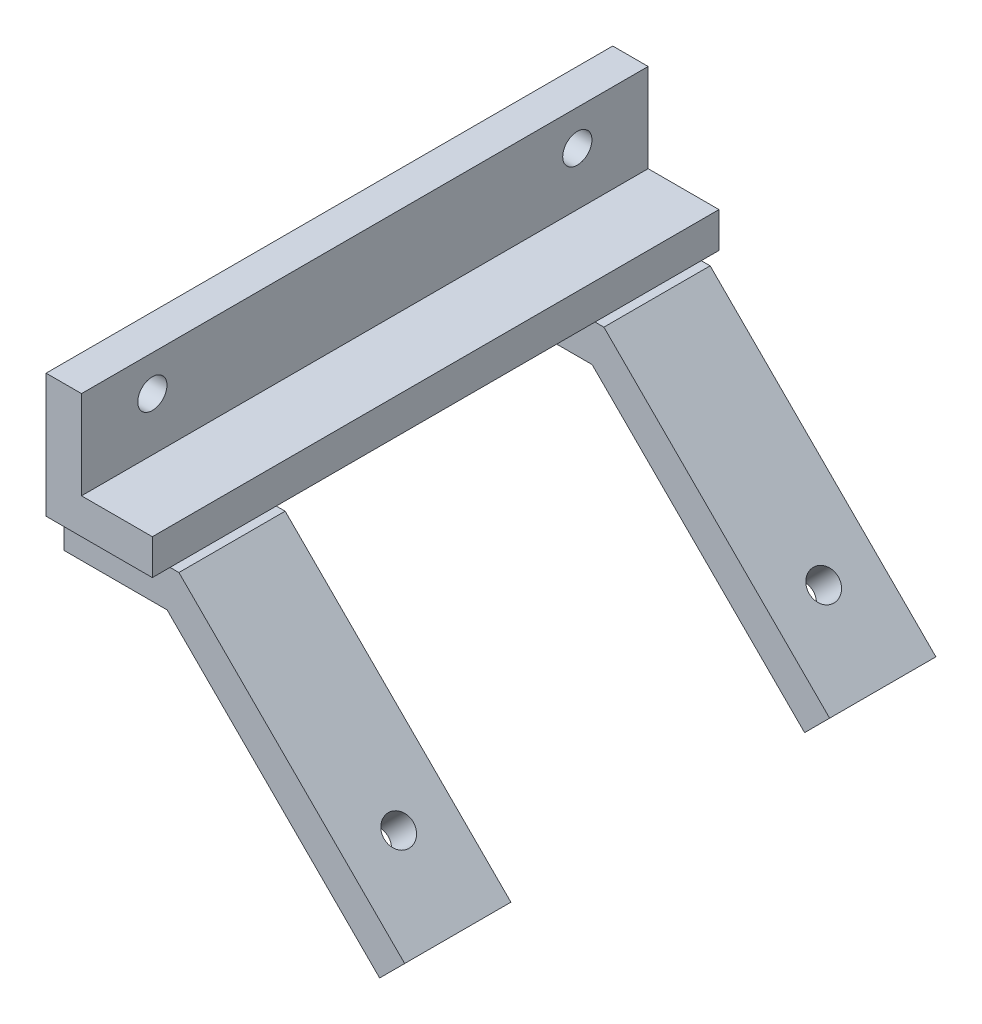
ISO-10303-21;
HEADER;
FILE_DESCRIPTION(('STEP AP214'),'2;1');
FILE_NAME('part.step','',(''),(''),'','','');
FILE_SCHEMA(('AUTOMOTIVE_DESIGN { 1 0 10303 214 1 1 1 1 }'));
ENDSEC;
DATA;
#1=APPLICATION_CONTEXT('core data for automotive mechanical design processes');
#2=APPLICATION_PROTOCOL_DEFINITION('international standard','automotive_design',2000,#1);
#3=PRODUCT_CONTEXT('',#1,'mechanical');
#4=PRODUCT('Part','Part','',(#3));
#5=PRODUCT_RELATED_PRODUCT_CATEGORY('part','',(#4));
#6=PRODUCT_DEFINITION_FORMATION('','',#4);
#7=PRODUCT_DEFINITION_CONTEXT('part definition',#1,'design');
#8=PRODUCT_DEFINITION('design','',#6,#7);
#9=PRODUCT_DEFINITION_SHAPE('','',#8);
#10=(LENGTH_UNIT() NAMED_UNIT(*) SI_UNIT(.MILLI.,.METRE.));
#11=(NAMED_UNIT(*) PLANE_ANGLE_UNIT() SI_UNIT($,.RADIAN.));
#12=(NAMED_UNIT(*) SI_UNIT($,.STERADIAN.) SOLID_ANGLE_UNIT());
#13=UNCERTAINTY_MEASURE_WITH_UNIT(LENGTH_MEASURE(1.E-05),#10,'distance_accuracy_value','');
#14=(GEOMETRIC_REPRESENTATION_CONTEXT(3) GLOBAL_UNCERTAINTY_ASSIGNED_CONTEXT((#13)) GLOBAL_UNIT_ASSIGNED_CONTEXT((#10,
#11,#12)) REPRESENTATION_CONTEXT('',''));
#15=CARTESIAN_POINT('',(0.,0.,0.));
#16=DIRECTION('',(0.,0.,1.));
#17=DIRECTION('',(1.,0.,0.));
#18=AXIS2_PLACEMENT_3D('',#15,#16,#17);
#19=CARTESIAN_POINT('',(0.,0.,32.));
#20=DIRECTION('',(0.,1.,0.));
#21=DIRECTION('',(0.,0.,1.));
#22=AXIS2_PLACEMENT_3D('',#19,#20,#21);
#23=PLANE('',#22);
#24=DIRECTION('',(-1.,0.,0.));
#25=VECTOR('',#24,1.);
#26=CARTESIAN_POINT('',(4.,0.,30.));
#27=LINE('',#26,#25);
#28=CARTESIAN_POINT('',(12.,0.,30.));
#29=VERTEX_POINT('',#28);
#30=CARTESIAN_POINT('',(0.,0.,30.));
#31=VERTEX_POINT('',#30);
#32=EDGE_CURVE('E194',#29,#31,#27,.T.);
#33=ORIENTED_EDGE('',*,*,#32,.F.);
#34=DIRECTION('',(0.,0.,-1.));
#35=VECTOR('',#34,1.);
#36=CARTESIAN_POINT('',(12.,0.,32.));
#37=LINE('',#36,#35);
#38=CARTESIAN_POINT('',(12.,0.,32.));
#39=VERTEX_POINT('',#38);
#40=EDGE_CURVE('E344',#39,#29,#37,.T.);
#41=ORIENTED_EDGE('',*,*,#40,.F.);
#42=DIRECTION('',(1.,0.,0.));
#43=VECTOR('',#42,1.);
#44=CARTESIAN_POINT('',(0.,0.,32.));
#45=LINE('',#44,#43);
#46=CARTESIAN_POINT('',(0.,0.,32.));
#47=VERTEX_POINT('',#46);
#48=EDGE_CURVE('E294',#47,#39,#45,.T.);
#49=ORIENTED_EDGE('',*,*,#48,.F.);
#50=DIRECTION('',(0.,0.,-1.));
#51=VECTOR('',#50,1.);
#52=CARTESIAN_POINT('',(0.,0.,32.));
#53=LINE('',#52,#51);
#54=EDGE_CURVE('E11',#47,#31,#53,.T.);
#55=ORIENTED_EDGE('',*,*,#54,.T.);
#56=EDGE_LOOP('',(#33,#41,#49,#55));
#57=FACE_BOUND('',#56,.T.);
#58=ADVANCED_FACE('F44',(#57),#23,.F.);
#59=CARTESIAN_POINT('',(12.,0.,18.));
#60=VERTEX_POINT('',#59);
#61=CARTESIAN_POINT('',(12.,0.,-18.));
#62=VERTEX_POINT('',#61);
#63=EDGE_CURVE('E348',#60,#62,#37,.T.);
#64=ORIENTED_EDGE('',*,*,#63,.F.);
#65=DIRECTION('',(-1.,0.,0.));
#66=VECTOR('',#65,1.);
#67=CARTESIAN_POINT('',(4.,0.,18.));
#68=LINE('',#67,#66);
#69=CARTESIAN_POINT('',(0.,0.,18.));
#70=VERTEX_POINT('',#69);
#71=EDGE_CURVE('E400',#60,#70,#68,.T.);
#72=ORIENTED_EDGE('',*,*,#71,.T.);
#73=CARTESIAN_POINT('',(0.,0.,-18.));
#74=VERTEX_POINT('',#73);
#75=EDGE_CURVE('E54',#70,#74,#53,.T.);
#76=ORIENTED_EDGE('',*,*,#75,.T.);
#77=DIRECTION('',(-1.,0.,0.));
#78=VECTOR('',#77,1.);
#79=CARTESIAN_POINT('',(4.,0.,-18.));
#80=LINE('',#79,#78);
#81=EDGE_CURVE('E248',#62,#74,#80,.T.);
#82=ORIENTED_EDGE('',*,*,#81,.F.);
#83=EDGE_LOOP('',(#64,#72,#76,#82));
#84=FACE_BOUND('',#83,.T.);
#85=ADVANCED_FACE('F468',(#84),#23,.F.);
#86=CARTESIAN_POINT('',(0.,14.,32.));
#87=DIRECTION('',(1.,0.,0.));
#88=DIRECTION('',(0.,0.,-1.));
#89=AXIS2_PLACEMENT_3D('',#86,#87,#88);
#90=PLANE('',#89);
#91=CARTESIAN_POINT('',(0.,10.,24.));
#92=DIRECTION('',(1.,0.,0.));
#93=DIRECTION('',(0.,0.,-1.));
#94=AXIS2_PLACEMENT_3D('',#91,#92,#93);
#95=CIRCLE('',#94,1.65);
#96=CARTESIAN_POINT('',(0.,10.,22.35));
#97=VERTEX_POINT('',#96);
#98=EDGE_CURVE('E354',#97,#97,#95,.T.);
#99=ORIENTED_EDGE('',*,*,#98,.T.);
#100=EDGE_LOOP('',(#99));
#101=FACE_BOUND('',#100,.T.);
#102=CARTESIAN_POINT('',(0.,10.,-24.));
#103=DIRECTION('',(1.,0.,0.));
#104=DIRECTION('',(0.,0.,-1.));
#105=AXIS2_PLACEMENT_3D('',#102,#103,#104);
#106=CIRCLE('',#105,1.65);
#107=CARTESIAN_POINT('',(0.,10.,-25.65));
#108=VERTEX_POINT('',#107);
#109=EDGE_CURVE('E221',#108,#108,#106,.T.);
#110=ORIENTED_EDGE('',*,*,#109,.T.);
#111=EDGE_LOOP('',(#110));
#112=FACE_BOUND('',#111,.T.);
#113=ORIENTED_EDGE('',*,*,#75,.F.);
#114=DIRECTION('',(0.,-1.,0.));
#115=VECTOR('',#114,1.);
#116=CARTESIAN_POINT('',(0.,0.,18.));
#117=LINE('',#116,#115);
#118=CARTESIAN_POINT('',(0.,-4.3284271247,18.));
#119=VERTEX_POINT('',#118);
#120=EDGE_CURVE('E199',#70,#119,#117,.T.);
#121=ORIENTED_EDGE('',*,*,#120,.T.);
#122=DIRECTION('',(0.,0.,-1.));
#123=VECTOR('',#122,1.);
#124=CARTESIAN_POINT('',(0.,-4.3284271247,30.));
#125=LINE('',#124,#123);
#126=CARTESIAN_POINT('',(0.,-4.3284271247,30.));
#127=VERTEX_POINT('',#126);
#128=EDGE_CURVE('E204',#127,#119,#125,.T.);
#129=ORIENTED_EDGE('',*,*,#128,.F.);
#130=DIRECTION('',(0.,-1.,0.));
#131=VECTOR('',#130,1.);
#132=CARTESIAN_POINT('',(0.,-4.3284271247,30.));
#133=LINE('',#132,#131);
#134=EDGE_CURVE('E187',#31,#127,#133,.T.);
#135=ORIENTED_EDGE('',*,*,#134,.F.);
#136=ORIENTED_EDGE('',*,*,#54,.F.);
#137=DIRECTION('',(0.,-1.,0.));
#138=VECTOR('',#137,1.);
#139=CARTESIAN_POINT('',(0.,14.,32.));
#140=LINE('',#139,#138);
#141=CARTESIAN_POINT('',(0.,14.,32.));
#142=VERTEX_POINT('',#141);
#143=EDGE_CURVE('E290',#142,#47,#140,.T.);
#144=ORIENTED_EDGE('',*,*,#143,.F.);
#145=DIRECTION('',(0.,0.,-1.));
#146=VECTOR('',#145,1.);
#147=CARTESIAN_POINT('',(0.,14.,32.));
#148=LINE('',#147,#146);
#149=CARTESIAN_POINT('',(0.,14.,-32.));
#150=VERTEX_POINT('',#149);
#151=EDGE_CURVE('E310',#142,#150,#148,.T.);
#152=ORIENTED_EDGE('',*,*,#151,.T.);
#153=DIRECTION('',(0.,-1.,0.));
#154=VECTOR('',#153,1.);
#155=CARTESIAN_POINT('',(0.,14.,-32.));
#156=LINE('',#155,#154);
#157=CARTESIAN_POINT('',(0.,0.,-32.));
#158=VERTEX_POINT('',#157);
#159=EDGE_CURVE('E289',#150,#158,#156,.T.);
#160=ORIENTED_EDGE('',*,*,#159,.T.);
#161=CARTESIAN_POINT('',(0.,0.,-30.));
#162=VERTEX_POINT('',#161);
#163=EDGE_CURVE('E56',#162,#158,#53,.T.);
#164=ORIENTED_EDGE('',*,*,#163,.F.);
#165=DIRECTION('',(0.,-1.,0.));
#166=VECTOR('',#165,1.);
#167=CARTESIAN_POINT('',(0.,0.,-30.));
#168=LINE('',#167,#166);
#169=CARTESIAN_POINT('',(0.,-4.3284271247,-30.));
#170=VERTEX_POINT('',#169);
#171=EDGE_CURVE('E236',#162,#170,#168,.T.);
#172=ORIENTED_EDGE('',*,*,#171,.T.);
#173=DIRECTION('',(0.,0.,-1.));
#174=VECTOR('',#173,1.);
#175=CARTESIAN_POINT('',(0.,-4.3284271247,-18.));
#176=LINE('',#175,#174);
#177=CARTESIAN_POINT('',(0.,-4.3284271247,-18.));
#178=VERTEX_POINT('',#177);
#179=EDGE_CURVE('E285',#178,#170,#176,.T.);
#180=ORIENTED_EDGE('',*,*,#179,.F.);
#181=DIRECTION('',(0.,-1.,0.));
#182=VECTOR('',#181,1.);
#183=CARTESIAN_POINT('',(0.,-4.3284271247,-18.));
#184=LINE('',#183,#182);
#185=EDGE_CURVE('E232',#74,#178,#184,.T.);
#186=ORIENTED_EDGE('',*,*,#185,.F.);
#187=EDGE_LOOP('',(#113,#121,#129,#135,#136,#144,#152,#160,#164,#172,#180,#186));
#188=FACE_BOUND('',#187,.T.);
#189=ADVANCED_FACE('F46',(#101,#112,#188),#90,.F.);
#190=CARTESIAN_POINT('',(12.,0.,-30.));
#191=VERTEX_POINT('',#190);
#192=CARTESIAN_POINT('',(12.,0.,-32.));
#193=VERTEX_POINT('',#192);
#194=EDGE_CURVE('E343',#191,#193,#37,.T.);
#195=ORIENTED_EDGE('',*,*,#194,.F.);
#196=DIRECTION('',(-1.,0.,0.));
#197=VECTOR('',#196,1.);
#198=CARTESIAN_POINT('',(4.,0.,-30.));
#199=LINE('',#198,#197);
#200=EDGE_CURVE('E266',#191,#162,#199,.T.);
#201=ORIENTED_EDGE('',*,*,#200,.T.);
#202=ORIENTED_EDGE('',*,*,#163,.T.);
#203=DIRECTION('',(1.,0.,0.));
#204=VECTOR('',#203,1.);
#205=CARTESIAN_POINT('',(0.,0.,-32.));
#206=LINE('',#205,#204);
#207=EDGE_CURVE('E313',#158,#193,#206,.T.);
#208=ORIENTED_EDGE('',*,*,#207,.T.);
#209=EDGE_LOOP('',(#195,#201,#202,#208));
#210=FACE_BOUND('',#209,.T.);
#211=ADVANCED_FACE('F458',(#210),#23,.F.);
#212=CARTESIAN_POINT('',(12.,0.,32.));
#213=DIRECTION('',(-1.,0.,0.));
#214=DIRECTION('',(0.,0.,1.));
#215=AXIS2_PLACEMENT_3D('',#212,#213,#214);
#216=PLANE('',#215);
#217=DIRECTION('',(0.,1.,0.));
#218=VECTOR('',#217,1.);
#219=CARTESIAN_POINT('',(12.,0.,-32.));
#220=LINE('',#219,#218);
#221=CARTESIAN_POINT('',(12.,4.,-32.));
#222=VERTEX_POINT('',#221);
#223=EDGE_CURVE('E317',#193,#222,#220,.T.);
#224=ORIENTED_EDGE('',*,*,#223,.T.);
#225=DIRECTION('',(0.,0.,-1.));
#226=VECTOR('',#225,1.);
#227=CARTESIAN_POINT('',(12.,4.,32.));
#228=LINE('',#227,#226);
#229=CARTESIAN_POINT('',(12.,4.,32.));
#230=VERTEX_POINT('',#229);
#231=EDGE_CURVE('E339',#230,#222,#228,.T.);
#232=ORIENTED_EDGE('',*,*,#231,.F.);
#233=DIRECTION('',(0.,1.,0.));
#234=VECTOR('',#233,1.);
#235=CARTESIAN_POINT('',(12.,0.,32.));
#236=LINE('',#235,#234);
#237=EDGE_CURVE('E298',#39,#230,#236,.T.);
#238=ORIENTED_EDGE('',*,*,#237,.F.);
#239=ORIENTED_EDGE('',*,*,#40,.T.);
#240=EDGE_CURVE('E347',#29,#60,#37,.T.);
#241=ORIENTED_EDGE('',*,*,#240,.T.);
#242=ORIENTED_EDGE('',*,*,#63,.T.);
#243=EDGE_CURVE('E349',#62,#191,#37,.T.);
#244=ORIENTED_EDGE('',*,*,#243,.T.);
#245=ORIENTED_EDGE('',*,*,#194,.T.);
#246=EDGE_LOOP('',(#224,#232,#238,#239,#241,#242,#244,#245));
#247=FACE_BOUND('',#246,.T.);
#248=ADVANCED_FACE('F435',(#247),#216,.F.);
#249=CARTESIAN_POINT('',(12.,4.,32.));
#250=DIRECTION('',(0.,-1.,0.));
#251=DIRECTION('',(0.,0.,-1.));
#252=AXIS2_PLACEMENT_3D('',#249,#250,#251);
#253=PLANE('',#252);
#254=DIRECTION('',(-1.,0.,0.));
#255=VECTOR('',#254,1.);
#256=CARTESIAN_POINT('',(12.,4.,-32.));
#257=LINE('',#256,#255);
#258=CARTESIAN_POINT('',(4.,4.,-32.));
#259=VERTEX_POINT('',#258);
#260=EDGE_CURVE('E320',#222,#259,#257,.T.);
#261=ORIENTED_EDGE('',*,*,#260,.T.);
#262=DIRECTION('',(0.,0.,-1.));
#263=VECTOR('',#262,1.);
#264=CARTESIAN_POINT('',(4.,4.,32.));
#265=LINE('',#264,#263);
#266=CARTESIAN_POINT('',(4.,4.,32.));
#267=VERTEX_POINT('',#266);
#268=EDGE_CURVE('E336',#267,#259,#265,.T.);
#269=ORIENTED_EDGE('',*,*,#268,.F.);
#270=DIRECTION('',(-1.,0.,0.));
#271=VECTOR('',#270,1.);
#272=CARTESIAN_POINT('',(12.,4.,32.));
#273=LINE('',#272,#271);
#274=EDGE_CURVE('E301',#230,#267,#273,.T.);
#275=ORIENTED_EDGE('',*,*,#274,.F.);
#276=ORIENTED_EDGE('',*,*,#231,.T.);
#277=EDGE_LOOP('',(#261,#269,#275,#276));
#278=FACE_BOUND('',#277,.T.);
#279=ADVANCED_FACE('F500',(#278),#253,.F.);
#280=CARTESIAN_POINT('',(4.,4.,32.));
#281=DIRECTION('',(-1.,0.,0.));
#282=DIRECTION('',(0.,0.,1.));
#283=AXIS2_PLACEMENT_3D('',#280,#281,#282);
#284=PLANE('',#283);
#285=CARTESIAN_POINT('',(4.,10.,24.));
#286=DIRECTION('',(-1.,0.,0.));
#287=DIRECTION('',(0.,0.,1.));
#288=AXIS2_PLACEMENT_3D('',#285,#286,#287);
#289=CIRCLE('',#288,1.65);
#290=CARTESIAN_POINT('',(4.,10.,25.65));
#291=VERTEX_POINT('',#290);
#292=EDGE_CURVE('E351',#291,#291,#289,.T.);
#293=ORIENTED_EDGE('',*,*,#292,.T.);
#294=EDGE_LOOP('',(#293));
#295=FACE_BOUND('',#294,.T.);
#296=CARTESIAN_POINT('',(4.,10.,-24.));
#297=DIRECTION('',(-1.,0.,0.));
#298=DIRECTION('',(0.,0.,1.));
#299=AXIS2_PLACEMENT_3D('',#296,#297,#298);
#300=CIRCLE('',#299,1.65);
#301=CARTESIAN_POINT('',(4.,10.,-22.35));
#302=VERTEX_POINT('',#301);
#303=EDGE_CURVE('E215',#302,#302,#300,.T.);
#304=ORIENTED_EDGE('',*,*,#303,.T.);
#305=EDGE_LOOP('',(#304));
#306=FACE_BOUND('',#305,.T.);
#307=DIRECTION('',(0.,1.,0.));
#308=VECTOR('',#307,1.);
#309=CARTESIAN_POINT('',(4.,4.,-32.));
#310=LINE('',#309,#308);
#311=CARTESIAN_POINT('',(4.,14.,-32.));
#312=VERTEX_POINT('',#311);
#313=EDGE_CURVE('E324',#259,#312,#310,.T.);
#314=ORIENTED_EDGE('',*,*,#313,.T.);
#315=DIRECTION('',(0.,0.,-1.));
#316=VECTOR('',#315,1.);
#317=CARTESIAN_POINT('',(4.,14.,32.));
#318=LINE('',#317,#316);
#319=CARTESIAN_POINT('',(4.,14.,32.));
#320=VERTEX_POINT('',#319);
#321=EDGE_CURVE('E333',#320,#312,#318,.T.);
#322=ORIENTED_EDGE('',*,*,#321,.F.);
#323=DIRECTION('',(0.,1.,0.));
#324=VECTOR('',#323,1.);
#325=CARTESIAN_POINT('',(4.,4.,32.));
#326=LINE('',#325,#324);
#327=EDGE_CURVE('E304',#267,#320,#326,.T.);
#328=ORIENTED_EDGE('',*,*,#327,.F.);
#329=ORIENTED_EDGE('',*,*,#268,.T.);
#330=EDGE_LOOP('',(#314,#322,#328,#329));
#331=FACE_BOUND('',#330,.T.);
#332=ADVANCED_FACE('F502',(#295,#306,#331),#284,.F.);
#333=CARTESIAN_POINT('',(4.,14.,32.));
#334=DIRECTION('',(0.,-1.,0.));
#335=DIRECTION('',(0.,0.,-1.));
#336=AXIS2_PLACEMENT_3D('',#333,#334,#335);
#337=PLANE('',#336);
#338=DIRECTION('',(-1.,0.,0.));
#339=VECTOR('',#338,1.);
#340=CARTESIAN_POINT('',(4.,14.,-32.));
#341=LINE('',#340,#339);
#342=EDGE_CURVE('E295',#312,#150,#341,.T.);
#343=ORIENTED_EDGE('',*,*,#342,.T.);
#344=ORIENTED_EDGE('',*,*,#151,.F.);
#345=DIRECTION('',(-1.,0.,0.));
#346=VECTOR('',#345,1.);
#347=CARTESIAN_POINT('',(4.,14.,32.));
#348=LINE('',#347,#346);
#349=EDGE_CURVE('E307',#320,#142,#348,.T.);
#350=ORIENTED_EDGE('',*,*,#349,.F.);
#351=ORIENTED_EDGE('',*,*,#321,.T.);
#352=EDGE_LOOP('',(#343,#344,#350,#351));
#353=FACE_BOUND('',#352,.T.);
#354=ADVANCED_FACE('F448',(#353),#337,.F.);
#355=CARTESIAN_POINT('',(0.,0.,32.));
#356=DIRECTION('',(0.,0.,1.));
#357=DIRECTION('',(1.,0.,0.));
#358=AXIS2_PLACEMENT_3D('',#355,#356,#357);
#359=PLANE('',#358);
#360=ORIENTED_EDGE('',*,*,#143,.T.);
#361=ORIENTED_EDGE('',*,*,#48,.T.);
#362=ORIENTED_EDGE('',*,*,#237,.T.);
#363=ORIENTED_EDGE('',*,*,#274,.T.);
#364=ORIENTED_EDGE('',*,*,#327,.T.);
#365=ORIENTED_EDGE('',*,*,#349,.T.);
#366=EDGE_LOOP('',(#360,#361,#362,#363,#364,#365));
#367=FACE_BOUND('',#366,.T.);
#368=ADVANCED_FACE('F439',(#367),#359,.T.);
#369=CARTESIAN_POINT('',(0.,0.,-32.));
#370=DIRECTION('',(0.,0.,1.));
#371=DIRECTION('',(1.,0.,0.));
#372=AXIS2_PLACEMENT_3D('',#369,#370,#371);
#373=PLANE('',#372);
#374=ORIENTED_EDGE('',*,*,#159,.F.);
#375=ORIENTED_EDGE('',*,*,#342,.F.);
#376=ORIENTED_EDGE('',*,*,#313,.F.);
#377=ORIENTED_EDGE('',*,*,#260,.F.);
#378=ORIENTED_EDGE('',*,*,#223,.F.);
#379=ORIENTED_EDGE('',*,*,#207,.F.);
#380=EDGE_LOOP('',(#374,#375,#376,#377,#378,#379));
#381=FACE_BOUND('',#380,.T.);
#382=ADVANCED_FACE('F453',(#381),#373,.F.);
#383=CARTESIAN_POINT('',(4.,0.,-18.));
#384=DIRECTION('',(0.,-1.,0.));
#385=DIRECTION('',(0.,0.,-1.));
#386=AXIS2_PLACEMENT_3D('',#383,#384,#385);
#387=PLANE('',#386);
#388=CARTESIAN_POINT('',(13.,0.,-30.));
#389=VERTEX_POINT('',#388);
#390=EDGE_CURVE('E71',#389,#191,#199,.T.);
#391=ORIENTED_EDGE('',*,*,#390,.T.);
#392=ORIENTED_EDGE('',*,*,#243,.F.);
#393=CARTESIAN_POINT('',(13.,0.,-18.));
#394=VERTEX_POINT('',#393);
#395=EDGE_CURVE('E249',#394,#62,#80,.T.);
#396=ORIENTED_EDGE('',*,*,#395,.F.);
#397=DIRECTION('',(0.,0.,-1.));
#398=VECTOR('',#397,1.);
#399=CARTESIAN_POINT('',(13.,0.,-18.));
#400=LINE('',#399,#398);
#401=EDGE_CURVE('E253',#394,#389,#400,.T.);
#402=ORIENTED_EDGE('',*,*,#401,.T.);
#403=EDGE_LOOP('',(#391,#392,#396,#402));
#404=FACE_BOUND('',#403,.T.);
#405=ADVANCED_FACE('F494',(#404),#387,.F.);
#406=CARTESIAN_POINT('',(0.,0.,-18.));
#407=DIRECTION('',(0.,0.,-1.));
#408=DIRECTION('',(-1.,0.,0.));
#409=AXIS2_PLACEMENT_3D('',#406,#407,#408);
#410=PLANE('',#409);
#411=ORIENTED_EDGE('',*,*,#81,.T.);
#412=ORIENTED_EDGE('',*,*,#185,.T.);
#413=DIRECTION('',(1.,0.,0.));
#414=VECTOR('',#413,1.);
#415=CARTESIAN_POINT('',(11.6715728753,-4.3284271247,-18.));
#416=LINE('',#415,#414);
#417=CARTESIAN_POINT('',(11.6715728753,-4.3284271247,-18.));
#418=VERTEX_POINT('',#417);
#419=EDGE_CURVE('E235',#178,#418,#416,.T.);
#420=ORIENTED_EDGE('',*,*,#419,.T.);
#421=DIRECTION('',(0.707106781186547,-0.707106781186548,0.));
#422=VECTOR('',#421,1.);
#423=CARTESIAN_POINT('',(35.6715728753,-28.3284271247,-18.));
#424=LINE('',#423,#422);
#425=CARTESIAN_POINT('',(35.6715728753,-28.3284271247,-18.));
#426=VERTEX_POINT('',#425);
#427=EDGE_CURVE('E239',#418,#426,#424,.T.);
#428=ORIENTED_EDGE('',*,*,#427,.T.);
#429=DIRECTION('',(0.707106781186547,0.707106781186547,0.));
#430=VECTOR('',#429,1.);
#431=CARTESIAN_POINT('',(38.5,-25.5,-18.));
#432=LINE('',#431,#430);
#433=CARTESIAN_POINT('',(38.5,-25.5,-18.));
#434=VERTEX_POINT('',#433);
#435=EDGE_CURVE('E242',#426,#434,#432,.T.);
#436=ORIENTED_EDGE('',*,*,#435,.T.);
#437=DIRECTION('',(-0.707106781186548,0.707106781186547,0.));
#438=VECTOR('',#437,1.);
#439=CARTESIAN_POINT('',(14.5,-1.5,-18.));
#440=LINE('',#439,#438);
#441=EDGE_CURVE('E245',#434,#394,#440,.T.);
#442=ORIENTED_EDGE('',*,*,#441,.T.);
#443=ORIENTED_EDGE('',*,*,#395,.T.);
#444=EDGE_LOOP('',(#411,#412,#420,#428,#436,#442,#443));
#445=FACE_BOUND('',#444,.T.);
#446=ADVANCED_FACE('F471',(#445),#410,.F.);
#447=CARTESIAN_POINT('',(0.,0.,-30.));
#448=DIRECTION('',(0.,0.,-1.));
#449=DIRECTION('',(-1.,0.,0.));
#450=AXIS2_PLACEMENT_3D('',#447,#448,#449);
#451=PLANE('',#450);
#452=ORIENTED_EDGE('',*,*,#171,.F.);
#453=ORIENTED_EDGE('',*,*,#200,.F.);
#454=ORIENTED_EDGE('',*,*,#390,.F.);
#455=DIRECTION('',(-0.707106781186548,0.707106781186547,0.));
#456=VECTOR('',#455,1.);
#457=CARTESIAN_POINT('',(13.,0.,-30.));
#458=LINE('',#457,#456);
#459=CARTESIAN_POINT('',(38.5,-25.5,-30.));
#460=VERTEX_POINT('',#459);
#461=EDGE_CURVE('E263',#460,#389,#458,.T.);
#462=ORIENTED_EDGE('',*,*,#461,.F.);
#463=DIRECTION('',(0.707106781186547,0.707106781186547,0.));
#464=VECTOR('',#463,1.);
#465=CARTESIAN_POINT('',(38.5,-25.5,-30.));
#466=LINE('',#465,#464);
#467=CARTESIAN_POINT('',(35.6715728753,-28.3284271247,-30.));
#468=VERTEX_POINT('',#467);
#469=EDGE_CURVE('E259',#468,#460,#466,.T.);
#470=ORIENTED_EDGE('',*,*,#469,.F.);
#471=DIRECTION('',(0.707106781186547,-0.707106781186548,0.));
#472=VECTOR('',#471,1.);
#473=CARTESIAN_POINT('',(35.6715728753,-28.3284271247,-30.));
#474=LINE('',#473,#472);
#475=CARTESIAN_POINT('',(11.6715728753,-4.3284271247,-30.));
#476=VERTEX_POINT('',#475);
#477=EDGE_CURVE('E256',#476,#468,#474,.T.);
#478=ORIENTED_EDGE('',*,*,#477,.F.);
#479=DIRECTION('',(1.,0.,0.));
#480=VECTOR('',#479,1.);
#481=CARTESIAN_POINT('',(11.6715728753,-4.3284271247,-30.));
#482=LINE('',#481,#480);
#483=EDGE_CURVE('E231',#170,#476,#482,.T.);
#484=ORIENTED_EDGE('',*,*,#483,.F.);
#485=EDGE_LOOP('',(#452,#453,#454,#462,#470,#478,#484));
#486=FACE_BOUND('',#485,.T.);
#487=ADVANCED_FACE('F547',(#486),#451,.T.);
#488=CARTESIAN_POINT('',(11.6715728753,-4.3284271247,-18.));
#489=DIRECTION('',(0.,1.,0.));
#490=DIRECTION('',(0.,0.,1.));
#491=AXIS2_PLACEMENT_3D('',#488,#489,#490);
#492=PLANE('',#491);
#493=ORIENTED_EDGE('',*,*,#483,.T.);
#494=DIRECTION('',(0.,0.,-1.));
#495=VECTOR('',#494,1.);
#496=CARTESIAN_POINT('',(11.6715728753,-4.3284271247,-18.));
#497=LINE('',#496,#495);
#498=EDGE_CURVE('E281',#418,#476,#497,.T.);
#499=ORIENTED_EDGE('',*,*,#498,.F.);
#500=ORIENTED_EDGE('',*,*,#419,.F.);
#501=ORIENTED_EDGE('',*,*,#179,.T.);
#502=EDGE_LOOP('',(#493,#499,#500,#501));
#503=FACE_BOUND('',#502,.T.);
#504=ADVANCED_FACE('F478',(#503),#492,.F.);
#505=CARTESIAN_POINT('',(35.6715728753,-28.3284271247,-18.));
#506=DIRECTION('',(0.707106781186548,0.707106781186547,0.));
#507=DIRECTION('',(-0.707106781186547,0.707106781186548,0.));
#508=AXIS2_PLACEMENT_3D('',#505,#506,#507);
#509=PLANE('',#508);
#510=CARTESIAN_POINT('',(28.9956890144,-21.6525432638,-24.));
#511=DIRECTION('',(0.707106781186548,0.707106781186547,0.));
#512=DIRECTION('',(-0.707106781186547,0.707106781186548,0.));
#513=AXIS2_PLACEMENT_3D('',#510,#511,#512);
#514=CIRCLE('',#513,1.65);
#515=CARTESIAN_POINT('',(27.8289628254422,-20.4858170748422,-24.));
#516=VERTEX_POINT('',#515);
#517=EDGE_CURVE('E355',#516,#516,#514,.T.);
#518=ORIENTED_EDGE('',*,*,#517,.T.);
#519=EDGE_LOOP('',(#518));
#520=FACE_BOUND('',#519,.T.);
#521=ORIENTED_EDGE('',*,*,#477,.T.);
#522=DIRECTION('',(0.,0.,-1.));
#523=VECTOR('',#522,1.);
#524=CARTESIAN_POINT('',(35.6715728753,-28.3284271247,-18.));
#525=LINE('',#524,#523);
#526=EDGE_CURVE('E277',#426,#468,#525,.T.);
#527=ORIENTED_EDGE('',*,*,#526,.F.);
#528=ORIENTED_EDGE('',*,*,#427,.F.);
#529=ORIENTED_EDGE('',*,*,#498,.T.);
#530=EDGE_LOOP('',(#521,#527,#528,#529));
#531=FACE_BOUND('',#530,.T.);
#532=ADVANCED_FACE('F485',(#520,#531),#509,.F.);
#533=CARTESIAN_POINT('',(38.5,-25.5,-18.));
#534=DIRECTION('',(-0.707106781186548,0.707106781186548,0.));
#535=DIRECTION('',(-0.707106781186548,-0.707106781186548,0.));
#536=AXIS2_PLACEMENT_3D('',#533,#534,#535);
#537=PLANE('',#536);
#538=ORIENTED_EDGE('',*,*,#469,.T.);
#539=DIRECTION('',(0.,0.,-1.));
#540=VECTOR('',#539,1.);
#541=CARTESIAN_POINT('',(38.5,-25.5,-18.));
#542=LINE('',#541,#540);
#543=EDGE_CURVE('E273',#434,#460,#542,.T.);
#544=ORIENTED_EDGE('',*,*,#543,.F.);
#545=ORIENTED_EDGE('',*,*,#435,.F.);
#546=ORIENTED_EDGE('',*,*,#526,.T.);
#547=EDGE_LOOP('',(#538,#544,#545,#546));
#548=FACE_BOUND('',#547,.T.);
#549=ADVANCED_FACE('F489',(#548),#537,.F.);
#550=CARTESIAN_POINT('',(13.,0.,-18.));
#551=DIRECTION('',(-0.707106781186547,-0.707106781186548,0.));
#552=DIRECTION('',(0.707106781186548,-0.707106781186547,0.));
#553=AXIS2_PLACEMENT_3D('',#550,#551,#552);
#554=PLANE('',#553);
#555=CARTESIAN_POINT('',(31.8241161391,-18.8241161391,-24.));
#556=DIRECTION('',(-0.707106781186547,-0.707106781186548,0.));
#557=DIRECTION('',(0.707106781186548,-0.707106781186547,0.));
#558=AXIS2_PLACEMENT_3D('',#555,#556,#557);
#559=CIRCLE('',#558,1.65);
#560=CARTESIAN_POINT('',(32.9908423280578,-19.9908423280578,-24.));
#561=VERTEX_POINT('',#560);
#562=EDGE_CURVE('E356',#561,#561,#559,.T.);
#563=ORIENTED_EDGE('',*,*,#562,.T.);
#564=EDGE_LOOP('',(#563));
#565=FACE_BOUND('',#564,.T.);
#566=ORIENTED_EDGE('',*,*,#461,.T.);
#567=ORIENTED_EDGE('',*,*,#401,.F.);
#568=ORIENTED_EDGE('',*,*,#441,.F.);
#569=ORIENTED_EDGE('',*,*,#543,.T.);
#570=EDGE_LOOP('',(#566,#567,#568,#569));
#571=FACE_BOUND('',#570,.T.);
#572=ADVANCED_FACE('F493',(#565,#571),#554,.F.);
#573=CARTESIAN_POINT('',(-100.,10.,-24.));
#574=DIRECTION('',(1.,0.,0.));
#575=DIRECTION('',(0.,0.,-1.));
#576=AXIS2_PLACEMENT_3D('',#573,#574,#575);
#577=CYLINDRICAL_SURFACE('',#576,1.65);
#578=ORIENTED_EDGE('',*,*,#303,.F.);
#579=EDGE_LOOP('',(#578));
#580=FACE_BOUND('',#579,.T.);
#581=ORIENTED_EDGE('',*,*,#109,.F.);
#582=EDGE_LOOP('',(#581));
#583=FACE_BOUND('',#582,.T.);
#584=ADVANCED_FACE('F531',(#580,#583),#577,.F.);
#585=CARTESIAN_POINT('',(4.,0.,30.));
#586=DIRECTION('',(0.,-1.,0.));
#587=DIRECTION('',(0.,0.,-1.));
#588=AXIS2_PLACEMENT_3D('',#585,#586,#587);
#589=PLANE('',#588);
#590=CARTESIAN_POINT('',(13.,0.,18.));
#591=VERTEX_POINT('',#590);
#592=EDGE_CURVE('E63',#591,#60,#68,.T.);
#593=ORIENTED_EDGE('',*,*,#592,.T.);
#594=ORIENTED_EDGE('',*,*,#240,.F.);
#595=CARTESIAN_POINT('',(13.,0.,30.));
#596=VERTEX_POINT('',#595);
#597=EDGE_CURVE('E385',#596,#29,#27,.T.);
#598=ORIENTED_EDGE('',*,*,#597,.F.);
#599=DIRECTION('',(0.,0.,-1.));
#600=VECTOR('',#599,1.);
#601=CARTESIAN_POINT('',(13.,0.,30.));
#602=LINE('',#601,#600);
#603=EDGE_CURVE('E388',#596,#591,#602,.T.);
#604=ORIENTED_EDGE('',*,*,#603,.T.);
#605=EDGE_LOOP('',(#593,#594,#598,#604));
#606=FACE_BOUND('',#605,.T.);
#607=ADVANCED_FACE('F428',(#606),#589,.F.);
#608=CARTESIAN_POINT('',(0.,0.,30.));
#609=DIRECTION('',(0.,0.,-1.));
#610=DIRECTION('',(-1.,0.,0.));
#611=AXIS2_PLACEMENT_3D('',#608,#609,#610);
#612=PLANE('',#611);
#613=ORIENTED_EDGE('',*,*,#32,.T.);
#614=ORIENTED_EDGE('',*,*,#134,.T.);
#615=DIRECTION('',(1.,0.,0.));
#616=VECTOR('',#615,1.);
#617=CARTESIAN_POINT('',(11.6715728753,-4.3284271247,30.));
#618=LINE('',#617,#616);
#619=CARTESIAN_POINT('',(11.6715728753,-4.3284271247,30.));
#620=VERTEX_POINT('',#619);
#621=EDGE_CURVE('E190',#127,#620,#618,.T.);
#622=ORIENTED_EDGE('',*,*,#621,.T.);
#623=DIRECTION('',(0.707106781186547,-0.707106781186548,0.));
#624=VECTOR('',#623,1.);
#625=CARTESIAN_POINT('',(35.6715728753,-28.3284271247,30.));
#626=LINE('',#625,#624);
#627=CARTESIAN_POINT('',(35.6715728753,-28.3284271247,30.));
#628=VERTEX_POINT('',#627);
#629=EDGE_CURVE('E209',#620,#628,#626,.T.);
#630=ORIENTED_EDGE('',*,*,#629,.T.);
#631=DIRECTION('',(0.707106781186547,0.707106781186547,0.));
#632=VECTOR('',#631,1.);
#633=CARTESIAN_POINT('',(38.5,-25.5,30.));
#634=LINE('',#633,#632);
#635=CARTESIAN_POINT('',(38.5,-25.5,30.));
#636=VERTEX_POINT('',#635);
#637=EDGE_CURVE('E380',#628,#636,#634,.T.);
#638=ORIENTED_EDGE('',*,*,#637,.T.);
#639=DIRECTION('',(-0.707106781186548,0.707106781186547,0.));
#640=VECTOR('',#639,1.);
#641=CARTESIAN_POINT('',(14.5,-1.5,30.));
#642=LINE('',#641,#640);
#643=EDGE_CURVE('E382',#636,#596,#642,.T.);
#644=ORIENTED_EDGE('',*,*,#643,.T.);
#645=ORIENTED_EDGE('',*,*,#597,.T.);
#646=EDGE_LOOP('',(#613,#614,#622,#630,#638,#644,#645));
#647=FACE_BOUND('',#646,.T.);
#648=ADVANCED_FACE('F189',(#647),#612,.F.);
#649=CARTESIAN_POINT('',(0.,0.,18.));
#650=DIRECTION('',(0.,0.,-1.));
#651=DIRECTION('',(-1.,0.,0.));
#652=AXIS2_PLACEMENT_3D('',#649,#650,#651);
#653=PLANE('',#652);
#654=ORIENTED_EDGE('',*,*,#120,.F.);
#655=ORIENTED_EDGE('',*,*,#71,.F.);
#656=ORIENTED_EDGE('',*,*,#592,.F.);
#657=DIRECTION('',(-0.707106781186548,0.707106781186547,0.));
#658=VECTOR('',#657,1.);
#659=CARTESIAN_POINT('',(13.,0.,18.));
#660=LINE('',#659,#658);
#661=CARTESIAN_POINT('',(38.5,-25.5,18.));
#662=VERTEX_POINT('',#661);
#663=EDGE_CURVE('E398',#662,#591,#660,.T.);
#664=ORIENTED_EDGE('',*,*,#663,.F.);
#665=DIRECTION('',(0.707106781186547,0.707106781186547,0.));
#666=VECTOR('',#665,1.);
#667=CARTESIAN_POINT('',(38.5,-25.5,18.));
#668=LINE('',#667,#666);
#669=CARTESIAN_POINT('',(35.6715728753,-28.3284271247,18.));
#670=VERTEX_POINT('',#669);
#671=EDGE_CURVE('E394',#670,#662,#668,.T.);
#672=ORIENTED_EDGE('',*,*,#671,.F.);
#673=DIRECTION('',(0.707106781186547,-0.707106781186548,0.));
#674=VECTOR('',#673,1.);
#675=CARTESIAN_POINT('',(35.6715728753,-28.3284271247,18.));
#676=LINE('',#675,#674);
#677=CARTESIAN_POINT('',(11.6715728753,-4.3284271247,18.));
#678=VERTEX_POINT('',#677);
#679=EDGE_CURVE('E391',#678,#670,#676,.T.);
#680=ORIENTED_EDGE('',*,*,#679,.F.);
#681=DIRECTION('',(1.,0.,0.));
#682=VECTOR('',#681,1.);
#683=CARTESIAN_POINT('',(11.6715728753,-4.3284271247,18.));
#684=LINE('',#683,#682);
#685=EDGE_CURVE('E376',#119,#678,#684,.T.);
#686=ORIENTED_EDGE('',*,*,#685,.F.);
#687=EDGE_LOOP('',(#654,#655,#656,#664,#672,#680,#686));
#688=FACE_BOUND('',#687,.T.);
#689=ADVANCED_FACE('F422',(#688),#653,.T.);
#690=CARTESIAN_POINT('',(11.6715728753,-4.3284271247,30.));
#691=DIRECTION('',(0.,1.,0.));
#692=DIRECTION('',(0.,0.,1.));
#693=AXIS2_PLACEMENT_3D('',#690,#691,#692);
#694=PLANE('',#693);
#695=ORIENTED_EDGE('',*,*,#685,.T.);
#696=DIRECTION('',(0.,0.,-1.));
#697=VECTOR('',#696,1.);
#698=CARTESIAN_POINT('',(11.6715728753,-4.3284271247,30.));
#699=LINE('',#698,#697);
#700=EDGE_CURVE('E206',#620,#678,#699,.T.);
#701=ORIENTED_EDGE('',*,*,#700,.F.);
#702=ORIENTED_EDGE('',*,*,#621,.F.);
#703=ORIENTED_EDGE('',*,*,#128,.T.);
#704=EDGE_LOOP('',(#695,#701,#702,#703));
#705=FACE_BOUND('',#704,.T.);
#706=ADVANCED_FACE('F203',(#705),#694,.F.);
#707=CARTESIAN_POINT('',(35.6715728753,-28.3284271247,30.));
#708=DIRECTION('',(0.707106781186548,0.707106781186547,0.));
#709=DIRECTION('',(-0.707106781186547,0.707106781186548,0.));
#710=AXIS2_PLACEMENT_3D('',#707,#708,#709);
#711=PLANE('',#710);
#712=CARTESIAN_POINT('',(28.9956890144,-21.6525432638,24.));
#713=DIRECTION('',(0.707106781186548,0.707106781186547,0.));
#714=DIRECTION('',(-0.707106781186547,0.707106781186548,0.));
#715=AXIS2_PLACEMENT_3D('',#712,#713,#714);
#716=CIRCLE('',#715,1.65);
#717=CARTESIAN_POINT('',(27.8289628254422,-20.4858170748422,24.));
#718=VERTEX_POINT('',#717);
#719=EDGE_CURVE('E359',#718,#718,#716,.T.);
#720=ORIENTED_EDGE('',*,*,#719,.T.);
#721=EDGE_LOOP('',(#720));
#722=FACE_BOUND('',#721,.T.);
#723=ORIENTED_EDGE('',*,*,#679,.T.);
#724=DIRECTION('',(0.,0.,-1.));
#725=VECTOR('',#724,1.);
#726=CARTESIAN_POINT('',(35.6715728753,-28.3284271247,30.));
#727=LINE('',#726,#725);
#728=EDGE_CURVE('E224',#628,#670,#727,.T.);
#729=ORIENTED_EDGE('',*,*,#728,.F.);
#730=ORIENTED_EDGE('',*,*,#629,.F.);
#731=ORIENTED_EDGE('',*,*,#700,.T.);
#732=EDGE_LOOP('',(#723,#729,#730,#731));
#733=FACE_BOUND('',#732,.T.);
#734=ADVANCED_FACE('F620',(#722,#733),#711,.F.);
#735=CARTESIAN_POINT('',(38.5,-25.5,30.));
#736=DIRECTION('',(-0.707106781186548,0.707106781186548,0.));
#737=DIRECTION('',(-0.707106781186548,-0.707106781186548,0.));
#738=AXIS2_PLACEMENT_3D('',#735,#736,#737);
#739=PLANE('',#738);
#740=ORIENTED_EDGE('',*,*,#671,.T.);
#741=DIRECTION('',(0.,0.,-1.));
#742=VECTOR('',#741,1.);
#743=CARTESIAN_POINT('',(38.5,-25.5,30.));
#744=LINE('',#743,#742);
#745=EDGE_CURVE('E407',#636,#662,#744,.T.);
#746=ORIENTED_EDGE('',*,*,#745,.F.);
#747=ORIENTED_EDGE('',*,*,#637,.F.);
#748=ORIENTED_EDGE('',*,*,#728,.T.);
#749=EDGE_LOOP('',(#740,#746,#747,#748));
#750=FACE_BOUND('',#749,.T.);
#751=ADVANCED_FACE('F417',(#750),#739,.F.);
#752=CARTESIAN_POINT('',(13.,0.,30.));
#753=DIRECTION('',(-0.707106781186547,-0.707106781186548,0.));
#754=DIRECTION('',(0.707106781186548,-0.707106781186547,0.));
#755=AXIS2_PLACEMENT_3D('',#752,#753,#754);
#756=PLANE('',#755);
#757=CARTESIAN_POINT('',(31.8241161391,-18.8241161391,24.));
#758=DIRECTION('',(-0.707106781186547,-0.707106781186548,0.));
#759=DIRECTION('',(0.707106781186548,-0.707106781186547,0.));
#760=AXIS2_PLACEMENT_3D('',#757,#758,#759);
#761=CIRCLE('',#760,1.65);
#762=CARTESIAN_POINT('',(32.9908423280578,-19.9908423280578,24.));
#763=VERTEX_POINT('',#762);
#764=EDGE_CURVE('E48',#763,#763,#761,.T.);
#765=ORIENTED_EDGE('',*,*,#764,.T.);
#766=EDGE_LOOP('',(#765));
#767=FACE_BOUND('',#766,.T.);
#768=ORIENTED_EDGE('',*,*,#663,.T.);
#769=ORIENTED_EDGE('',*,*,#603,.F.);
#770=ORIENTED_EDGE('',*,*,#643,.F.);
#771=ORIENTED_EDGE('',*,*,#745,.T.);
#772=EDGE_LOOP('',(#768,#769,#770,#771));
#773=FACE_BOUND('',#772,.T.);
#774=ADVANCED_FACE('F425',(#767,#773),#756,.F.);
#775=CARTESIAN_POINT('',(-100.,10.,24.));
#776=DIRECTION('',(1.,0.,0.));
#777=DIRECTION('',(0.,0.,-1.));
#778=AXIS2_PLACEMENT_3D('',#775,#776,#777);
#779=CYLINDRICAL_SURFACE('',#778,1.65);
#780=ORIENTED_EDGE('',*,*,#292,.F.);
#781=EDGE_LOOP('',(#780));
#782=FACE_BOUND('',#781,.T.);
#783=ORIENTED_EDGE('',*,*,#98,.F.);
#784=EDGE_LOOP('',(#783));
#785=FACE_BOUND('',#784,.T.);
#786=ADVANCED_FACE('F641',(#782,#785),#779,.F.);
#787=CARTESIAN_POINT('',(-38.8865619795547,-89.5347942577548,-24.));
#788=DIRECTION('',(0.707106781186547,0.707106781186548,0.));
#789=DIRECTION('',(-0.707106781186548,0.707106781186547,0.));
#790=AXIS2_PLACEMENT_3D('',#787,#788,#789);
#791=CYLINDRICAL_SURFACE('',#790,1.65);
#792=ORIENTED_EDGE('',*,*,#562,.F.);
#793=EDGE_LOOP('',(#792));
#794=FACE_BOUND('',#793,.T.);
#795=ORIENTED_EDGE('',*,*,#517,.F.);
#796=EDGE_LOOP('',(#795));
#797=FACE_BOUND('',#796,.T.);
#798=ADVANCED_FACE('F651',(#794,#797),#791,.F.);
#799=CARTESIAN_POINT('',(-38.8865619795547,-89.5347942577548,24.));
#800=DIRECTION('',(0.707106781186547,0.707106781186548,0.));
#801=DIRECTION('',(-0.707106781186548,0.707106781186547,0.));
#802=AXIS2_PLACEMENT_3D('',#799,#800,#801);
#803=CYLINDRICAL_SURFACE('',#802,1.65);
#804=ORIENTED_EDGE('',*,*,#764,.F.);
#805=EDGE_LOOP('',(#804));
#806=FACE_BOUND('',#805,.T.);
#807=ORIENTED_EDGE('',*,*,#719,.F.);
#808=EDGE_LOOP('',(#807));
#809=FACE_BOUND('',#808,.T.);
#810=ADVANCED_FACE('F660',(#806,#809),#803,.F.);
#811=CLOSED_SHELL('',(#58,#85,#189,#211,#248,#279,#332,#354,#368,#382,#405,#446,#487,#504,#532,
#549,#572,#584,#607,#648,#689,#706,#734,#751,#774,#786,#798,#810));
#812=MANIFOLD_SOLID_BREP('B2',#811);
#813=ADVANCED_BREP_SHAPE_REPRESENTATION('',(#18,#812),#14);
#814=SHAPE_DEFINITION_REPRESENTATION(#9,#813);
ENDSEC;
END-ISO-10303-21;
